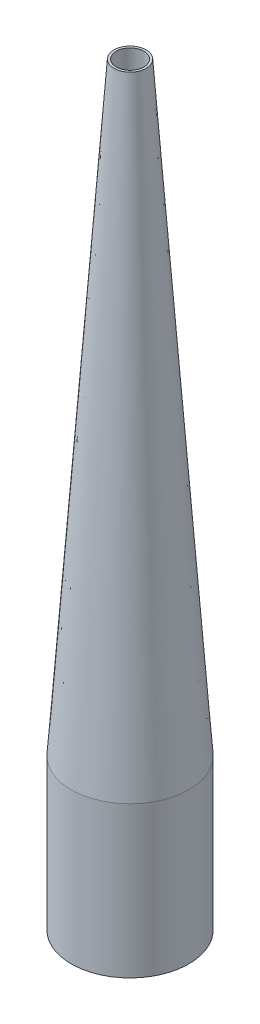
ISO-10303-21;
HEADER;
FILE_DESCRIPTION(('STEP AP214'),'2;1');
FILE_NAME('part.step','',(''),(''),'','','');
FILE_SCHEMA(('AUTOMOTIVE_DESIGN { 1 0 10303 214 1 1 1 1 }'));
ENDSEC;
DATA;
#1=APPLICATION_CONTEXT('core data for automotive mechanical design processes');
#2=APPLICATION_PROTOCOL_DEFINITION('international standard','automotive_design',2000,#1);
#3=PRODUCT_CONTEXT('',#1,'mechanical');
#4=PRODUCT('Part','Part','',(#3));
#5=PRODUCT_RELATED_PRODUCT_CATEGORY('part','',(#4));
#6=PRODUCT_DEFINITION_FORMATION('','',#4);
#7=PRODUCT_DEFINITION_CONTEXT('part definition',#1,'design');
#8=PRODUCT_DEFINITION('design','',#6,#7);
#9=PRODUCT_DEFINITION_SHAPE('','',#8);
#10=(LENGTH_UNIT() NAMED_UNIT(*) SI_UNIT(.MILLI.,.METRE.));
#11=(NAMED_UNIT(*) PLANE_ANGLE_UNIT() SI_UNIT($,.RADIAN.));
#12=(NAMED_UNIT(*) SI_UNIT($,.STERADIAN.) SOLID_ANGLE_UNIT());
#13=UNCERTAINTY_MEASURE_WITH_UNIT(LENGTH_MEASURE(1.E-05),#10,'distance_accuracy_value','');
#14=(GEOMETRIC_REPRESENTATION_CONTEXT(3) GLOBAL_UNCERTAINTY_ASSIGNED_CONTEXT((#13)) GLOBAL_UNIT_ASSIGNED_CONTEXT((#10,
#11,#12)) REPRESENTATION_CONTEXT('',''));
#15=CARTESIAN_POINT('',(0.,0.,0.));
#16=DIRECTION('',(0.,0.,1.));
#17=DIRECTION('',(1.,0.,0.));
#18=AXIS2_PLACEMENT_3D('',#15,#16,#17);
#19=CARTESIAN_POINT('',(0.,558.8,0.));
#20=DIRECTION('',(0.,-1.,0.));
#21=DIRECTION('',(0.,0.,-1.));
#22=AXIS2_PLACEMENT_3D('',#19,#20,#21);
#23=CONICAL_SURFACE('',#22,0.,0.070790602187564);
#24=CARTESIAN_POINT('',(0.,0.,0.));
#25=DIRECTION('',(0.,-1.,0.));
#26=DIRECTION('',(0.,0.,-1.));
#27=AXIS2_PLACEMENT_3D('',#24,#25,#26);
#28=CIRCLE('',#27,39.624);
#29=CARTESIAN_POINT('',(0.,0.,-39.624));
#30=VERTEX_POINT('',#29);
#31=EDGE_CURVE('E54',#30,#30,#28,.T.);
#32=CARTESIAN_POINT('',(0.,406.4,0.));
#33=DIRECTION('',(0.,1.,0.));
#34=DIRECTION('',(0.,0.,1.));
#35=AXIS2_PLACEMENT_3D('',#32,#33,#34);
#36=CIRCLE('',#35,10.8065454545455);
#37=CARTESIAN_POINT('',(0.,406.4,-10.8065454545455));
#38=VERTEX_POINT('',#37);
#39=EDGE_CURVE('E73',#38,#38,#36,.T.);
#40=CARTESIAN_POINT('',(0.,0.,-39.624));
#41=CARTESIAN_POINT('',(0.,4.23333333333334,-39.3238181818182));
#42=CARTESIAN_POINT('',(0.,8.4666666666667,-39.0236363636363));
#43=CARTESIAN_POINT('',(0.,16.9333333333334,-38.4232727272727));
#44=CARTESIAN_POINT('',(0.,21.1666666666667,-38.1230909090909));
#45=CARTESIAN_POINT('',(0.,29.6333333333333,-37.5227272727273));
#46=CARTESIAN_POINT('',(0.,33.8666666666667,-37.2225454545454));
#47=CARTESIAN_POINT('',(0.,42.3333333333333,-36.6221818181818));
#48=CARTESIAN_POINT('',(0.,46.5666666666666,-36.322));
#49=CARTESIAN_POINT('',(0.,55.0333333333333,-35.7216363636364));
#50=CARTESIAN_POINT('',(0.,59.2666666666667,-35.4214545454545));
#51=CARTESIAN_POINT('',(0.,67.7333333333333,-34.8210909090909));
#52=CARTESIAN_POINT('',(0.,71.9666666666667,-34.5209090909091));
#53=CARTESIAN_POINT('',(0.,80.4333333333333,-33.9205454545454));
#54=CARTESIAN_POINT('',(0.,84.6666666666667,-33.6203636363636));
#55=CARTESIAN_POINT('',(0.,93.1333333333333,-33.02));
#56=CARTESIAN_POINT('',(0.,97.3666666666666,-32.7198181818182));
#57=CARTESIAN_POINT('',(0.,105.833333333333,-32.1194545454545));
#58=CARTESIAN_POINT('',(0.,110.066666666667,-31.8192727272727));
#59=CARTESIAN_POINT('',(0.,118.533333333333,-31.2189090909091));
#60=CARTESIAN_POINT('',(0.,122.766666666667,-30.9187272727273));
#61=CARTESIAN_POINT('',(0.,131.233333333333,-30.3183636363636));
#62=CARTESIAN_POINT('',(0.,135.466666666667,-30.0181818181818));
#63=CARTESIAN_POINT('',(0.,143.933333333333,-29.4178181818182));
#64=CARTESIAN_POINT('',(0.,148.166666666667,-29.1176363636364));
#65=CARTESIAN_POINT('',(0.,156.633333333333,-28.5172727272727));
#66=CARTESIAN_POINT('',(0.,160.866666666667,-28.2170909090909));
#67=CARTESIAN_POINT('',(0.,169.333333333333,-27.6167272727273));
#68=CARTESIAN_POINT('',(0.,173.566666666667,-27.3165454545454));
#69=CARTESIAN_POINT('',(0.,182.033333333333,-26.7161818181818));
#70=CARTESIAN_POINT('',(0.,186.266666666667,-26.416));
#71=CARTESIAN_POINT('',(0.,194.733333333333,-25.8156363636364));
#72=CARTESIAN_POINT('',(0.,198.966666666667,-25.5154545454545));
#73=CARTESIAN_POINT('',(0.,207.433333333333,-24.9150909090909));
#74=CARTESIAN_POINT('',(0.,211.666666666667,-24.6149090909091));
#75=CARTESIAN_POINT('',(0.,220.133333333333,-24.0145454545454));
#76=CARTESIAN_POINT('',(0.,224.366666666667,-23.7143636363636));
#77=CARTESIAN_POINT('',(0.,232.833333333333,-23.114));
#78=CARTESIAN_POINT('',(0.,237.066666666667,-22.8138181818182));
#79=CARTESIAN_POINT('',(0.,245.533333333333,-22.2134545454545));
#80=CARTESIAN_POINT('',(0.,249.766666666667,-21.9132727272727));
#81=CARTESIAN_POINT('',(0.,258.233333333333,-21.3129090909091));
#82=CARTESIAN_POINT('',(0.,262.466666666667,-21.0127272727273));
#83=CARTESIAN_POINT('',(0.,270.933333333333,-20.4123636363636));
#84=CARTESIAN_POINT('',(0.,275.166666666667,-20.1121818181818));
#85=CARTESIAN_POINT('',(0.,283.633333333333,-19.5118181818182));
#86=CARTESIAN_POINT('',(0.,287.866666666667,-19.2116363636364));
#87=CARTESIAN_POINT('',(0.,296.333333333333,-18.6112727272727));
#88=CARTESIAN_POINT('',(0.,300.566666666667,-18.3110909090909));
#89=CARTESIAN_POINT('',(0.,309.033333333333,-17.7107272727273));
#90=CARTESIAN_POINT('',(0.,313.266666666667,-17.4105454545455));
#91=CARTESIAN_POINT('',(0.,321.733333333333,-16.8101818181818));
#92=CARTESIAN_POINT('',(0.,325.966666666667,-16.51));
#93=CARTESIAN_POINT('',(0.,334.433333333333,-15.9096363636364));
#94=CARTESIAN_POINT('',(0.,338.666666666667,-15.6094545454545));
#95=CARTESIAN_POINT('',(0.,347.133333333333,-15.0090909090909));
#96=CARTESIAN_POINT('',(0.,351.366666666667,-14.7089090909091));
#97=CARTESIAN_POINT('',(0.,359.833333333333,-14.1085454545455));
#98=CARTESIAN_POINT('',(0.,364.066666666667,-13.8083636363636));
#99=CARTESIAN_POINT('',(0.,372.533333333333,-13.208));
#100=CARTESIAN_POINT('',(0.,376.766666666667,-12.9078181818182));
#101=CARTESIAN_POINT('',(0.,385.233333333333,-12.3074545454545));
#102=CARTESIAN_POINT('',(0.,389.466666666667,-12.0072727272727));
#103=CARTESIAN_POINT('',(0.,397.933333333333,-11.4069090909091));
#104=CARTESIAN_POINT('',(0.,402.166666666667,-11.1067272727273));
#105=CARTESIAN_POINT('',(0.,406.4,-10.8065454545455));
#106=B_SPLINE_CURVE_WITH_KNOTS('',3,(#40,#41,#42,#43,#44,#45,#46,#47,#48,#49,#50,#51,#52,#53,
#54,#55,#56,#57,#58,#59,#60,#61,#62,#63,#64,#65,#66,#67,#68,#69,#70,#71,#72,#73,#74,#75,#76,#77,
#78,#79,#80,#81,#82,#83,#84,#85,#86,#87,#88,#89,#90,#91,#92,#93,#94,#95,#96,#97,#98,#99,#100,
#101,#102,#103,#104,#105),.UNSPECIFIED.,.F.,.F.,(4,2,2,2,2,2,2,2,2,2,2,2,2,2,2,2,2,2,2,2,2,2,2,
2,2,2,2,2,2,2,2,2,4),(0.,12.7318883955093,25.4637767910184,38.1956651865277,50.9275535820369,
63.6594419775461,76.3913303730553,89.1232187685646,101.855107164074,114.586995559583,
127.318883955092,140.050772350601,152.782660746111,165.51454914162,178.246437537129,
190.978325932638,203.710214328148,216.442102723657,229.173991119166,241.905879514675,
254.637767910184,267.369656305694,280.101544701203,292.833433096712,305.565321492221,
318.29720988773,331.02909828324,343.760986678749,356.492875074258,369.224763469767,
381.956651865277,394.688540260786,407.420428656295),.UNSPECIFIED.);
#107=EDGE_CURVE('BSEAM45',#30,#38,#106,.T.);
#108=ORIENTED_EDGE('',*,*,#31,.F.);
#109=ORIENTED_EDGE('',*,*,#39,.F.);
#110=ORIENTED_EDGE('',*,*,#107,.T.);
#111=ORIENTED_EDGE('',*,*,#107,.F.);
#112=EDGE_LOOP('',(#108,#110,#109,#111));
#113=FACE_BOUND('',#112,.T.);
#114=ADVANCED_FACE('F45',(#113),#23,.T.);
#115=CARTESIAN_POINT('',(0.,537.253727330677,0.));
#116=DIRECTION('',(0.,-1.,0.));
#117=DIRECTION('',(0.,0.,-1.));
#118=AXIS2_PLACEMENT_3D('',#115,#116,#117);
#119=CONICAL_SURFACE('',#118,0.,0.070790602187564);
#120=CARTESIAN_POINT('',(0.,0.,0.));
#121=DIRECTION('',(0.,1.,0.));
#122=DIRECTION('',(0.,0.,1.));
#123=AXIS2_PLACEMENT_3D('',#120,#121,#122);
#124=CIRCLE('',#123,38.0961733925389);
#125=CARTESIAN_POINT('',(0.,-1.11022302462516E-13,-38.0961733925389));
#126=VERTEX_POINT('',#125);
#127=EDGE_CURVE('E66',#126,#126,#124,.F.);
#128=CARTESIAN_POINT('',(0.,406.4,0.));
#129=DIRECTION('',(0.,1.,0.));
#130=DIRECTION('',(0.,0.,1.));
#131=AXIS2_PLACEMENT_3D('',#128,#129,#130);
#132=CIRCLE('',#131,9.27871884708434);
#133=CARTESIAN_POINT('',(0.,406.4,-9.27871884708435));
#134=VERTEX_POINT('',#133);
#135=EDGE_CURVE('E49',#134,#134,#132,.T.);
#136=CARTESIAN_POINT('',(0.,-1.11022302462516E-13,-38.0961733925389));
#137=CARTESIAN_POINT('',(0.,4.23333333333323,-37.7959915743571));
#138=CARTESIAN_POINT('',(0.,8.46666666666659,-37.4958097561753));
#139=CARTESIAN_POINT('',(0.,16.9333333333332,-36.8954461198116));
#140=CARTESIAN_POINT('',(0.,21.1666666666666,-36.5952643016298));
#141=CARTESIAN_POINT('',(0.,29.6333333333332,-35.9949006652662));
#142=CARTESIAN_POINT('',(0.,33.8666666666666,-35.6947188470843));
#143=CARTESIAN_POINT('',(0.,42.3333333333332,-35.0943552107207));
#144=CARTESIAN_POINT('',(0.,46.5666666666666,-34.7941733925389));
#145=CARTESIAN_POINT('',(0.,55.0333333333332,-34.1938097561753));
#146=CARTESIAN_POINT('',(0.,59.2666666666666,-33.8936279379934));
#147=CARTESIAN_POINT('',(0.,67.7333333333332,-33.2932643016298));
#148=CARTESIAN_POINT('',(0.,71.9666666666666,-32.993082483448));
#149=CARTESIAN_POINT('',(0.,80.4333333333332,-32.3927188470843));
#150=CARTESIAN_POINT('',(0.,84.6666666666665,-32.0925370289025));
#151=CARTESIAN_POINT('',(0.,93.1333333333332,-31.4921733925389));
#152=CARTESIAN_POINT('',(0.,97.3666666666666,-31.1919915743571));
#153=CARTESIAN_POINT('',(0.,105.833333333333,-30.5916279379934));
#154=CARTESIAN_POINT('',(0.,110.066666666667,-30.2914461198116));
#155=CARTESIAN_POINT('',(0.,118.533333333333,-29.691082483448));
#156=CARTESIAN_POINT('',(0.,122.766666666667,-29.3909006652662));
#157=CARTESIAN_POINT('',(0.,131.233333333333,-28.7905370289025));
#158=CARTESIAN_POINT('',(0.,135.466666666667,-28.4903552107207));
#159=CARTESIAN_POINT('',(0.,143.933333333333,-27.8899915743571));
#160=CARTESIAN_POINT('',(0.,148.166666666667,-27.5898097561753));
#161=CARTESIAN_POINT('',(0.,156.633333333333,-26.9894461198116));
#162=CARTESIAN_POINT('',(0.,160.866666666667,-26.6892643016298));
#163=CARTESIAN_POINT('',(0.,169.333333333333,-26.0889006652662));
#164=CARTESIAN_POINT('',(0.,173.566666666667,-25.7887188470843));
#165=CARTESIAN_POINT('',(0.,182.033333333333,-25.1883552107207));
#166=CARTESIAN_POINT('',(0.,186.266666666667,-24.8881733925389));
#167=CARTESIAN_POINT('',(0.,194.733333333333,-24.2878097561753));
#168=CARTESIAN_POINT('',(0.,198.966666666667,-23.9876279379934));
#169=CARTESIAN_POINT('',(0.,207.433333333333,-23.3872643016298));
#170=CARTESIAN_POINT('',(0.,211.666666666667,-23.087082483448));
#171=CARTESIAN_POINT('',(0.,220.133333333333,-22.4867188470844));
#172=CARTESIAN_POINT('',(0.,224.366666666667,-22.1865370289025));
#173=CARTESIAN_POINT('',(0.,232.833333333333,-21.5861733925389));
#174=CARTESIAN_POINT('',(0.,237.066666666667,-21.2859915743571));
#175=CARTESIAN_POINT('',(0.,245.533333333333,-20.6856279379934));
#176=CARTESIAN_POINT('',(0.,249.766666666667,-20.3854461198116));
#177=CARTESIAN_POINT('',(0.,258.233333333333,-19.785082483448));
#178=CARTESIAN_POINT('',(0.,262.466666666667,-19.4849006652662));
#179=CARTESIAN_POINT('',(0.,270.933333333333,-18.8845370289025));
#180=CARTESIAN_POINT('',(0.,275.166666666667,-18.5843552107207));
#181=CARTESIAN_POINT('',(0.,283.633333333333,-17.9839915743571));
#182=CARTESIAN_POINT('',(0.,287.866666666667,-17.6838097561753));
#183=CARTESIAN_POINT('',(0.,296.333333333333,-17.0834461198116));
#184=CARTESIAN_POINT('',(0.,300.566666666667,-16.7832643016298));
#185=CARTESIAN_POINT('',(0.,309.033333333333,-16.1829006652662));
#186=CARTESIAN_POINT('',(0.,313.266666666667,-15.8827188470844));
#187=CARTESIAN_POINT('',(0.,321.733333333333,-15.2823552107207));
#188=CARTESIAN_POINT('',(0.,325.966666666667,-14.9821733925389));
#189=CARTESIAN_POINT('',(0.,334.433333333333,-14.3818097561753));
#190=CARTESIAN_POINT('',(0.,338.666666666667,-14.0816279379934));
#191=CARTESIAN_POINT('',(0.,347.133333333333,-13.4812643016298));
#192=CARTESIAN_POINT('',(0.,351.366666666667,-13.181082483448));
#193=CARTESIAN_POINT('',(0.,359.833333333333,-12.5807188470844));
#194=CARTESIAN_POINT('',(0.,364.066666666667,-12.2805370289025));
#195=CARTESIAN_POINT('',(0.,372.533333333333,-11.6801733925389));
#196=CARTESIAN_POINT('',(0.,376.766666666667,-11.3799915743571));
#197=CARTESIAN_POINT('',(0.,385.233333333333,-10.7796279379934));
#198=CARTESIAN_POINT('',(0.,389.466666666667,-10.4794461198116));
#199=CARTESIAN_POINT('',(0.,397.933333333333,-9.87908248344798));
#200=CARTESIAN_POINT('',(0.,402.166666666667,-9.57890066526617));
#201=CARTESIAN_POINT('',(0.,406.4,-9.27871884708435));
#202=B_SPLINE_CURVE_WITH_KNOTS('',3,(#136,#137,#138,#139,#140,#141,#142,#143,#144,#145,#146,
#147,#148,#149,#150,#151,#152,#153,#154,#155,#156,#157,#158,#159,#160,#161,#162,#163,#164,#165,
#166,#167,#168,#169,#170,#171,#172,#173,#174,#175,#176,#177,#178,#179,#180,#181,#182,#183,#184,
#185,#186,#187,#188,#189,#190,#191,#192,#193,#194,#195,#196,#197,#198,#199,#200,#201),
.UNSPECIFIED.,.F.,.F.,(4,2,2,2,2,2,2,2,2,2,2,2,2,2,2,2,2,2,2,2,2,2,2,2,2,2,2,2,2,2,2,2,4),(0.,
12.7318883955093,25.4637767910184,38.1956651865277,50.9275535820369,63.6594419775461,
76.3913303730553,89.1232187685646,101.855107164074,114.586995559583,127.318883955092,
140.050772350602,152.782660746111,165.51454914162,178.246437537129,190.978325932638,
203.710214328148,216.442102723657,229.173991119166,241.905879514675,254.637767910184,
267.369656305694,280.101544701203,292.833433096712,305.565321492221,318.297209887731,
331.02909828324,343.760986678749,356.492875074258,369.224763469767,381.956651865277,
394.688540260786,407.420428656295),.UNSPECIFIED.);
#203=EDGE_CURVE('BSEAM82',#126,#134,#202,.T.);
#204=ORIENTED_EDGE('',*,*,#127,.T.);
#205=ORIENTED_EDGE('',*,*,#135,.T.);
#206=ORIENTED_EDGE('',*,*,#203,.T.);
#207=ORIENTED_EDGE('',*,*,#203,.F.);
#208=EDGE_LOOP('',(#204,#206,#205,#207));
#209=FACE_BOUND('',#208,.T.);
#210=ADVANCED_FACE('F82',(#209),#119,.F.);
#211=CARTESIAN_POINT('',(-39.624,-101.6,0.));
#212=DIRECTION('',(0.,1.,0.));
#213=DIRECTION('',(0.,0.,1.));
#214=AXIS2_PLACEMENT_3D('',#211,#212,#213);
#215=PLANE('',#214);
#216=CARTESIAN_POINT('',(0.,-101.6,0.));
#217=DIRECTION('',(0.,1.,0.));
#218=DIRECTION('',(0.,0.,1.));
#219=AXIS2_PLACEMENT_3D('',#216,#217,#218);
#220=CIRCLE('',#219,38.1);
#221=CARTESIAN_POINT('',(0.,-101.6,38.1));
#222=VERTEX_POINT('',#221);
#223=EDGE_CURVE('E59',#222,#222,#220,.T.);
#224=ORIENTED_EDGE('',*,*,#223,.T.);
#225=EDGE_LOOP('',(#224));
#226=FACE_BOUND('',#225,.T.);
#227=CARTESIAN_POINT('',(0.,-101.6,0.));
#228=DIRECTION('',(0.,-1.,0.));
#229=DIRECTION('',(0.,0.,-1.));
#230=AXIS2_PLACEMENT_3D('',#227,#228,#229);
#231=CIRCLE('',#230,39.624);
#232=CARTESIAN_POINT('',(0.,-101.6,-39.624));
#233=VERTEX_POINT('',#232);
#234=EDGE_CURVE('E10',#233,#233,#231,.T.);
#235=ORIENTED_EDGE('',*,*,#234,.T.);
#236=EDGE_LOOP('',(#235));
#237=FACE_BOUND('',#236,.T.);
#238=ADVANCED_FACE('F47',(#226,#237),#215,.F.);
#239=CARTESIAN_POINT('',(0.,0.,0.));
#240=DIRECTION('',(0.,-1.,0.));
#241=DIRECTION('',(0.,0.,-1.));
#242=AXIS2_PLACEMENT_3D('',#239,#240,#241);
#243=CYLINDRICAL_SURFACE('',#242,39.624);
#244=ORIENTED_EDGE('',*,*,#234,.F.);
#245=EDGE_LOOP('',(#244));
#246=FACE_BOUND('',#245,.T.);
#247=ORIENTED_EDGE('',*,*,#31,.T.);
#248=EDGE_LOOP('',(#247));
#249=FACE_BOUND('',#248,.T.);
#250=ADVANCED_FACE('F105',(#246,#249),#243,.T.);
#251=CARTESIAN_POINT('',(0.,-101.6,0.));
#252=DIRECTION('',(0.,1.,0.));
#253=DIRECTION('',(0.,0.,1.));
#254=AXIS2_PLACEMENT_3D('',#251,#252,#253);
#255=CYLINDRICAL_SURFACE('',#254,38.1);
#256=ORIENTED_EDGE('',*,*,#223,.F.);
#257=EDGE_LOOP('',(#256));
#258=FACE_BOUND('',#257,.T.);
#259=CARTESIAN_POINT('',(0.,0.,0.));
#260=DIRECTION('',(0.,1.,0.));
#261=DIRECTION('',(0.,0.,1.));
#262=AXIS2_PLACEMENT_3D('',#259,#260,#261);
#263=CIRCLE('',#262,38.1);
#264=CARTESIAN_POINT('',(0.,0.,38.1));
#265=VERTEX_POINT('',#264);
#266=EDGE_CURVE('E62',#265,#265,#263,.T.);
#267=ORIENTED_EDGE('',*,*,#266,.T.);
#268=EDGE_LOOP('',(#267));
#269=FACE_BOUND('',#268,.T.);
#270=ADVANCED_FACE('F92',(#258,#269),#255,.F.);
#271=CARTESIAN_POINT('',(0.,0.,0.));
#272=DIRECTION('',(0.,1.,0.));
#273=DIRECTION('',(0.,0.,1.));
#274=AXIS2_PLACEMENT_3D('',#271,#272,#273);
#275=PLANE('',#274);
#276=ORIENTED_EDGE('',*,*,#127,.F.);
#277=EDGE_LOOP('',(#276));
#278=FACE_BOUND('',#277,.T.);
#279=ORIENTED_EDGE('',*,*,#266,.F.);
#280=EDGE_LOOP('',(#279));
#281=FACE_BOUND('',#280,.T.);
#282=ADVANCED_FACE('F86',(#278,#281),#275,.F.);
#283=CARTESIAN_POINT('',(0.,406.4,0.));
#284=DIRECTION('',(0.,1.,0.));
#285=DIRECTION('',(0.,0.,1.));
#286=AXIS2_PLACEMENT_3D('',#283,#284,#285);
#287=PLANE('',#286);
#288=ORIENTED_EDGE('',*,*,#135,.F.);
#289=EDGE_LOOP('',(#288));
#290=FACE_BOUND('',#289,.T.);
#291=ORIENTED_EDGE('',*,*,#39,.T.);
#292=EDGE_LOOP('',(#291));
#293=FACE_BOUND('',#292,.T.);
#294=ADVANCED_FACE('F84',(#290,#293),#287,.T.);
#295=CLOSED_SHELL('',(#114,#210,#238,#250,#270,#282,#294));
#296=MANIFOLD_SOLID_BREP('B2',#295);
#297=ADVANCED_BREP_SHAPE_REPRESENTATION('',(#18,#296),#14);
#298=SHAPE_DEFINITION_REPRESENTATION(#9,#297);
ENDSEC;
END-ISO-10303-21;
